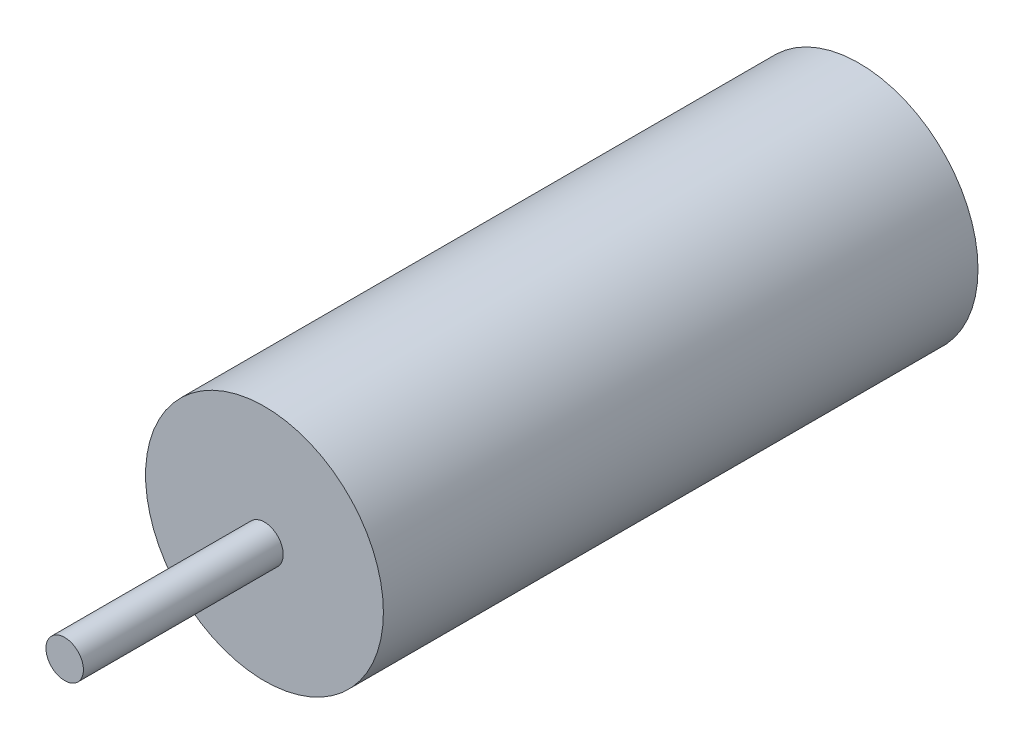
ISO-10303-21;
HEADER;
FILE_DESCRIPTION(('STEP AP214'),'2;1');
FILE_NAME('part.step','',(''),(''),'','','');
FILE_SCHEMA(('AUTOMOTIVE_DESIGN { 1 0 10303 214 1 1 1 1 }'));
ENDSEC;
DATA;
#1=APPLICATION_CONTEXT('core data for automotive mechanical design processes');
#2=APPLICATION_PROTOCOL_DEFINITION('international standard','automotive_design',2000,#1);
#3=PRODUCT_CONTEXT('',#1,'mechanical');
#4=PRODUCT('Part','Part','',(#3));
#5=PRODUCT_RELATED_PRODUCT_CATEGORY('part','',(#4));
#6=PRODUCT_DEFINITION_FORMATION('','',#4);
#7=PRODUCT_DEFINITION_CONTEXT('part definition',#1,'design');
#8=PRODUCT_DEFINITION('design','',#6,#7);
#9=PRODUCT_DEFINITION_SHAPE('','',#8);
#10=(LENGTH_UNIT() NAMED_UNIT(*) SI_UNIT(.MILLI.,.METRE.));
#11=(NAMED_UNIT(*) PLANE_ANGLE_UNIT() SI_UNIT($,.RADIAN.));
#12=(NAMED_UNIT(*) SI_UNIT($,.STERADIAN.) SOLID_ANGLE_UNIT());
#13=UNCERTAINTY_MEASURE_WITH_UNIT(LENGTH_MEASURE(1.E-05),#10,'distance_accuracy_value','');
#14=(GEOMETRIC_REPRESENTATION_CONTEXT(3) GLOBAL_UNCERTAINTY_ASSIGNED_CONTEXT((#13)) GLOBAL_UNIT_ASSIGNED_CONTEXT((#10,
#11,#12)) REPRESENTATION_CONTEXT('',''));
#15=CARTESIAN_POINT('',(0.,0.,0.));
#16=DIRECTION('',(0.,0.,1.));
#17=DIRECTION('',(1.,0.,0.));
#18=AXIS2_PLACEMENT_3D('',#15,#16,#17);
#19=CARTESIAN_POINT('',(0.,0.,127.));
#20=DIRECTION('',(0.,0.,-1.));
#21=DIRECTION('',(-1.,0.,0.));
#22=AXIS2_PLACEMENT_3D('',#19,#20,#21);
#23=CYLINDRICAL_SURFACE('',#22,25.4);
#24=CARTESIAN_POINT('',(0.,0.,127.));
#25=DIRECTION('',(0.,0.,1.));
#26=DIRECTION('',(1.,0.,0.));
#27=AXIS2_PLACEMENT_3D('',#24,#25,#26);
#28=CIRCLE('',#27,25.4);
#29=CARTESIAN_POINT('',(25.4,0.,127.));
#30=VERTEX_POINT('',#29);
#31=EDGE_CURVE('E12',#30,#30,#28,.T.);
#32=ORIENTED_EDGE('',*,*,#31,.F.);
#33=EDGE_LOOP('',(#32));
#34=FACE_BOUND('',#33,.T.);
#35=CARTESIAN_POINT('',(0.,0.,0.));
#36=DIRECTION('',(0.,0.,1.));
#37=DIRECTION('',(1.,0.,0.));
#38=AXIS2_PLACEMENT_3D('',#35,#36,#37);
#39=CIRCLE('',#38,25.4);
#40=CARTESIAN_POINT('',(25.4,0.,0.));
#41=VERTEX_POINT('',#40);
#42=EDGE_CURVE('E46',#41,#41,#39,.T.);
#43=ORIENTED_EDGE('',*,*,#42,.T.);
#44=EDGE_LOOP('',(#43));
#45=FACE_BOUND('',#44,.T.);
#46=ADVANCED_FACE('F43',(#34,#45),#23,.T.);
#47=CARTESIAN_POINT('',(0.,0.,127.));
#48=DIRECTION('',(0.,0.,1.));
#49=DIRECTION('',(1.,0.,0.));
#50=AXIS2_PLACEMENT_3D('',#47,#48,#49);
#51=PLANE('',#50);
#52=CARTESIAN_POINT('',(0.,0.,127.));
#53=DIRECTION('',(0.,0.,1.));
#54=DIRECTION('',(1.,0.,0.));
#55=AXIS2_PLACEMENT_3D('',#52,#53,#54);
#56=CIRCLE('',#55,4.0005);
#57=CARTESIAN_POINT('',(4.0005,0.,127.));
#58=VERTEX_POINT('',#57);
#59=EDGE_CURVE('E55',#58,#58,#56,.T.);
#60=ORIENTED_EDGE('',*,*,#59,.F.);
#61=EDGE_LOOP('',(#60));
#62=FACE_BOUND('',#61,.T.);
#63=ORIENTED_EDGE('',*,*,#31,.T.);
#64=EDGE_LOOP('',(#63));
#65=FACE_BOUND('',#64,.T.);
#66=ADVANCED_FACE('F70',(#62,#65),#51,.T.);
#67=CARTESIAN_POINT('',(0.,0.,0.));
#68=DIRECTION('',(0.,0.,1.));
#69=DIRECTION('',(1.,0.,0.));
#70=AXIS2_PLACEMENT_3D('',#67,#68,#69);
#71=PLANE('',#70);
#72=ORIENTED_EDGE('',*,*,#42,.F.);
#73=EDGE_LOOP('',(#72));
#74=FACE_BOUND('',#73,.T.);
#75=ADVANCED_FACE('F66',(#74),#71,.F.);
#76=CARTESIAN_POINT('',(0.,0.,169.672));
#77=DIRECTION('',(0.,0.,-1.));
#78=DIRECTION('',(-1.,0.,0.));
#79=AXIS2_PLACEMENT_3D('',#76,#77,#78);
#80=CYLINDRICAL_SURFACE('',#79,4.0005);
#81=CARTESIAN_POINT('',(0.,0.,169.672));
#82=DIRECTION('',(0.,0.,1.));
#83=DIRECTION('',(1.,0.,0.));
#84=AXIS2_PLACEMENT_3D('',#81,#82,#83);
#85=CIRCLE('',#84,4.0005);
#86=CARTESIAN_POINT('',(4.0005,0.,169.672));
#87=VERTEX_POINT('',#86);
#88=EDGE_CURVE('E53',#87,#87,#85,.T.);
#89=ORIENTED_EDGE('',*,*,#88,.F.);
#90=EDGE_LOOP('',(#89));
#91=FACE_BOUND('',#90,.T.);
#92=ORIENTED_EDGE('',*,*,#59,.T.);
#93=EDGE_LOOP('',(#92));
#94=FACE_BOUND('',#93,.T.);
#95=ADVANCED_FACE('F63',(#91,#94),#80,.T.);
#96=CARTESIAN_POINT('',(0.,0.,169.672));
#97=DIRECTION('',(0.,0.,1.));
#98=DIRECTION('',(1.,0.,0.));
#99=AXIS2_PLACEMENT_3D('',#96,#97,#98);
#100=PLANE('',#99);
#101=ORIENTED_EDGE('',*,*,#88,.T.);
#102=EDGE_LOOP('',(#101));
#103=FACE_BOUND('',#102,.T.);
#104=ADVANCED_FACE('F61',(#103),#100,.T.);
#105=CLOSED_SHELL('',(#46,#66,#75,#95,#104));
#106=MANIFOLD_SOLID_BREP('B2',#105);
#107=ADVANCED_BREP_SHAPE_REPRESENTATION('',(#18,#106),#14);
#108=SHAPE_DEFINITION_REPRESENTATION(#9,#107);
ENDSEC;
END-ISO-10303-21;
